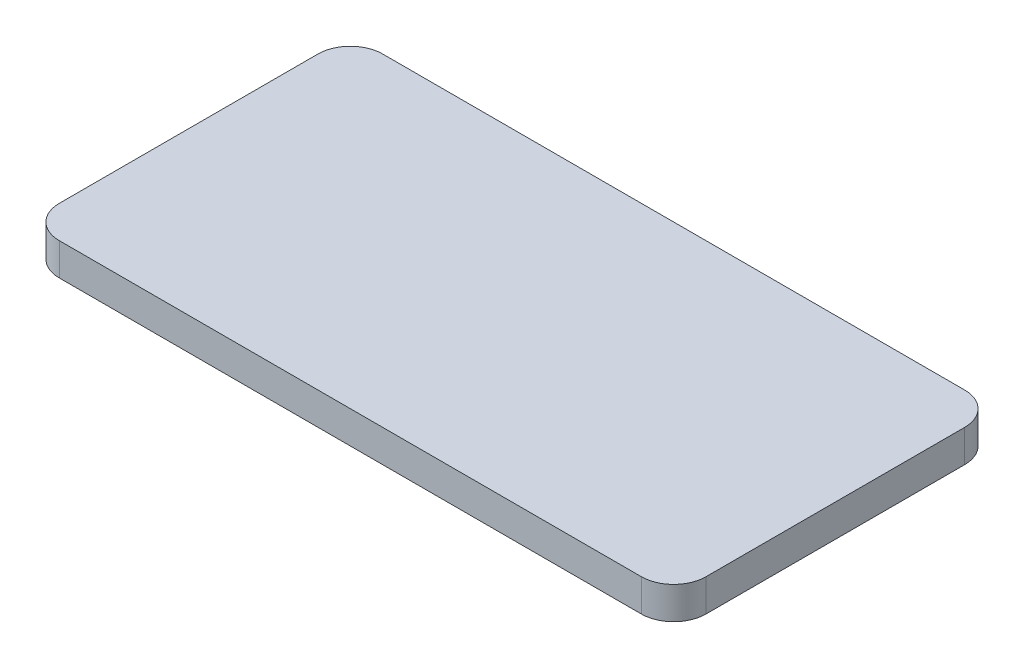
ISO-10303-21;
HEADER;
FILE_DESCRIPTION(('STEP AP214'),'2;1');
FILE_NAME('part.step','',(''),(''),'','','');
FILE_SCHEMA(('AUTOMOTIVE_DESIGN { 1 0 10303 214 1 1 1 1 }'));
ENDSEC;
DATA;
#1=APPLICATION_CONTEXT('core data for automotive mechanical design processes');
#2=APPLICATION_PROTOCOL_DEFINITION('international standard','automotive_design',2000,#1);
#3=PRODUCT_CONTEXT('',#1,'mechanical');
#4=PRODUCT('Part','Part','',(#3));
#5=PRODUCT_RELATED_PRODUCT_CATEGORY('part','',(#4));
#6=PRODUCT_DEFINITION_FORMATION('','',#4);
#7=PRODUCT_DEFINITION_CONTEXT('part definition',#1,'design');
#8=PRODUCT_DEFINITION('design','',#6,#7);
#9=PRODUCT_DEFINITION_SHAPE('','',#8);
#10=(LENGTH_UNIT() NAMED_UNIT(*) SI_UNIT(.MILLI.,.METRE.));
#11=(NAMED_UNIT(*) PLANE_ANGLE_UNIT() SI_UNIT($,.RADIAN.));
#12=(NAMED_UNIT(*) SI_UNIT($,.STERADIAN.) SOLID_ANGLE_UNIT());
#13=UNCERTAINTY_MEASURE_WITH_UNIT(LENGTH_MEASURE(1.E-05),#10,'distance_accuracy_value','');
#14=(GEOMETRIC_REPRESENTATION_CONTEXT(3) GLOBAL_UNCERTAINTY_ASSIGNED_CONTEXT((#13)) GLOBAL_UNIT_ASSIGNED_CONTEXT((#10,
#11,#12)) REPRESENTATION_CONTEXT('',''));
#15=CARTESIAN_POINT('',(0.,0.,0.));
#16=DIRECTION('',(0.,0.,1.));
#17=DIRECTION('',(1.,0.,0.));
#18=AXIS2_PLACEMENT_3D('',#15,#16,#17);
#19=CARTESIAN_POINT('',(44.7077153816655,1.,19.));
#20=DIRECTION('',(1.,0.,0.));
#21=DIRECTION('',(0.,0.,-1.));
#22=AXIS2_PLACEMENT_3D('',#19,#20,#21);
#23=PLANE('',#22);
#24=DIRECTION('',(0.,1.,0.));
#25=VECTOR('',#24,1.);
#26=CARTESIAN_POINT('',(44.7077153816655,-1.,15.1511621443385));
#27=LINE('',#26,#25);
#28=CARTESIAN_POINT('',(44.7077153816655,1.,15.1511621443385));
#29=VERTEX_POINT('',#28);
#30=CARTESIAN_POINT('',(44.7077153816655,0.,15.1511621443385));
#31=VERTEX_POINT('',#30);
#32=EDGE_CURVE('E290',#29,#31,#27,.F.);
#33=ORIENTED_EDGE('',*,*,#32,.F.);
#34=DIRECTION('',(0.,0.,1.));
#35=VECTOR('',#34,1.);
#36=CARTESIAN_POINT('',(44.7077153816655,1.,19.));
#37=LINE('',#36,#35);
#38=CARTESIAN_POINT('',(44.7077153816655,1.,6.00000000000001));
#39=VERTEX_POINT('',#38);
#40=EDGE_CURVE('E300',#39,#29,#37,.T.);
#41=ORIENTED_EDGE('',*,*,#40,.F.);
#42=DIRECTION('',(0.,-1.,0.));
#43=VECTOR('',#42,1.);
#44=CARTESIAN_POINT('',(44.7077153816655,1.,6.00000000000001));
#45=LINE('',#44,#43);
#46=CARTESIAN_POINT('',(44.7077153816655,0.,6.00000000000001));
#47=VERTEX_POINT('',#46);
#48=EDGE_CURVE('E575',#39,#47,#45,.T.);
#49=ORIENTED_EDGE('',*,*,#48,.T.);
#50=DIRECTION('',(0.,0.,1.));
#51=VECTOR('',#50,1.);
#52=CARTESIAN_POINT('',(44.7077153816655,0.,19.));
#53=LINE('',#52,#51);
#54=EDGE_CURVE('E41',#47,#31,#53,.T.);
#55=ORIENTED_EDGE('',*,*,#54,.T.);
#56=EDGE_LOOP('',(#33,#41,#49,#55));
#57=FACE_BOUND('',#56,.T.);
#58=ADVANCED_FACE('F37',(#57),#23,.F.);
#59=DIRECTION('',(0.,1.,0.));
#60=VECTOR('',#59,1.);
#61=CARTESIAN_POINT('',(44.7077153816655,-1.,15.3712700855343));
#62=LINE('',#61,#60);
#63=CARTESIAN_POINT('',(44.7077153816655,0.,15.3712700855343));
#64=VERTEX_POINT('',#63);
#65=CARTESIAN_POINT('',(44.7077153816655,1.,15.3712700855343));
#66=VERTEX_POINT('',#65);
#67=EDGE_CURVE('E63',#64,#66,#62,.T.);
#68=ORIENTED_EDGE('',*,*,#67,.F.);
#69=CARTESIAN_POINT('',(44.7077153816655,0.,19.));
#70=VERTEX_POINT('',#69);
#71=EDGE_CURVE('E332',#64,#70,#53,.T.);
#72=ORIENTED_EDGE('',*,*,#71,.T.);
#73=DIRECTION('',(0.,-1.,0.));
#74=VECTOR('',#73,1.);
#75=CARTESIAN_POINT('',(44.7077153816655,1.,19.));
#76=LINE('',#75,#74);
#77=CARTESIAN_POINT('',(44.7077153816655,1.,19.));
#78=VERTEX_POINT('',#77);
#79=EDGE_CURVE('E570',#78,#70,#76,.T.);
#80=ORIENTED_EDGE('',*,*,#79,.F.);
#81=EDGE_CURVE('E304',#66,#78,#37,.T.);
#82=ORIENTED_EDGE('',*,*,#81,.F.);
#83=EDGE_LOOP('',(#68,#72,#80,#82));
#84=FACE_BOUND('',#83,.T.);
#85=ADVANCED_FACE('F385',(#84),#23,.F.);
#86=CARTESIAN_POINT('',(45.,5.,-20.));
#87=DIRECTION('',(0.,-1.,0.));
#88=DIRECTION('',(0.,0.,-1.));
#89=AXIS2_PLACEMENT_3D('',#86,#87,#88);
#90=CYLINDRICAL_SURFACE('',#89,5.);
#91=CARTESIAN_POINT('',(45.,0.,-20.));
#92=DIRECTION('',(0.,1.,0.));
#93=DIRECTION('',(0.,0.,-1.));
#94=AXIS2_PLACEMENT_3D('',#91,#92,#93);
#95=CIRCLE('',#94,5.);
#96=CARTESIAN_POINT('',(50.,0.,-20.));
#97=VERTEX_POINT('',#96);
#98=CARTESIAN_POINT('',(45.,0.,-25.));
#99=VERTEX_POINT('',#98);
#100=EDGE_CURVE('E467',#97,#99,#95,.T.);
#101=ORIENTED_EDGE('',*,*,#100,.T.);
#102=DIRECTION('',(0.,-1.,0.));
#103=VECTOR('',#102,1.);
#104=CARTESIAN_POINT('',(45.,5.,-25.));
#105=LINE('',#104,#103);
#106=CARTESIAN_POINT('',(45.,5.,-25.));
#107=VERTEX_POINT('',#106);
#108=EDGE_CURVE('E503',#107,#99,#105,.T.);
#109=ORIENTED_EDGE('',*,*,#108,.F.);
#110=CARTESIAN_POINT('',(45.,5.,-20.));
#111=DIRECTION('',(0.,1.,0.));
#112=DIRECTION('',(0.,0.,-1.));
#113=AXIS2_PLACEMENT_3D('',#110,#111,#112);
#114=CIRCLE('',#113,5.);
#115=CARTESIAN_POINT('',(50.,5.,-20.));
#116=VERTEX_POINT('',#115);
#117=EDGE_CURVE('E448',#116,#107,#114,.T.);
#118=ORIENTED_EDGE('',*,*,#117,.F.);
#119=DIRECTION('',(0.,-1.,0.));
#120=VECTOR('',#119,1.);
#121=CARTESIAN_POINT('',(50.,5.,-20.));
#122=LINE('',#121,#120);
#123=EDGE_CURVE('E466',#116,#97,#122,.T.);
#124=ORIENTED_EDGE('',*,*,#123,.T.);
#125=EDGE_LOOP('',(#101,#109,#118,#124));
#126=FACE_BOUND('',#125,.T.);
#127=ADVANCED_FACE('F39',(#126),#90,.T.);
#128=CARTESIAN_POINT('',(-45.,5.,-25.));
#129=DIRECTION('',(0.,0.,1.));
#130=DIRECTION('',(1.,0.,0.));
#131=AXIS2_PLACEMENT_3D('',#128,#129,#130);
#132=PLANE('',#131);
#133=DIRECTION('',(-1.,0.,0.));
#134=VECTOR('',#133,1.);
#135=CARTESIAN_POINT('',(-45.,0.,-25.));
#136=LINE('',#135,#134);
#137=CARTESIAN_POINT('',(-45.,0.,-25.));
#138=VERTEX_POINT('',#137);
#139=EDGE_CURVE('E470',#99,#138,#136,.T.);
#140=ORIENTED_EDGE('',*,*,#139,.T.);
#141=DIRECTION('',(0.,-1.,0.));
#142=VECTOR('',#141,1.);
#143=CARTESIAN_POINT('',(-45.,5.,-25.));
#144=LINE('',#143,#142);
#145=CARTESIAN_POINT('',(-45.,5.,-25.));
#146=VERTEX_POINT('',#145);
#147=EDGE_CURVE('E500',#146,#138,#144,.T.);
#148=ORIENTED_EDGE('',*,*,#147,.F.);
#149=DIRECTION('',(-1.,0.,0.));
#150=VECTOR('',#149,1.);
#151=CARTESIAN_POINT('',(-45.,5.,-25.));
#152=LINE('',#151,#150);
#153=EDGE_CURVE('E451',#107,#146,#152,.T.);
#154=ORIENTED_EDGE('',*,*,#153,.F.);
#155=ORIENTED_EDGE('',*,*,#108,.T.);
#156=EDGE_LOOP('',(#140,#148,#154,#155));
#157=FACE_BOUND('',#156,.T.);
#158=ADVANCED_FACE('F378',(#157),#132,.F.);
#159=CARTESIAN_POINT('',(-45.,5.,-20.));
#160=DIRECTION('',(0.,-1.,0.));
#161=DIRECTION('',(0.,0.,-1.));
#162=AXIS2_PLACEMENT_3D('',#159,#160,#161);
#163=CYLINDRICAL_SURFACE('',#162,5.);
#164=CARTESIAN_POINT('',(-45.,0.,-20.));
#165=DIRECTION('',(0.,1.,0.));
#166=DIRECTION('',(0.,0.,-1.));
#167=AXIS2_PLACEMENT_3D('',#164,#165,#166);
#168=CIRCLE('',#167,5.);
#169=CARTESIAN_POINT('',(-50.,0.,-20.));
#170=VERTEX_POINT('',#169);
#171=EDGE_CURVE('E472',#138,#170,#168,.T.);
#172=ORIENTED_EDGE('',*,*,#171,.T.);
#173=DIRECTION('',(0.,-1.,0.));
#174=VECTOR('',#173,1.);
#175=CARTESIAN_POINT('',(-50.,5.,-20.));
#176=LINE('',#175,#174);
#177=CARTESIAN_POINT('',(-50.,5.,-20.));
#178=VERTEX_POINT('',#177);
#179=EDGE_CURVE('E497',#178,#170,#176,.T.);
#180=ORIENTED_EDGE('',*,*,#179,.F.);
#181=CARTESIAN_POINT('',(-45.,5.,-20.));
#182=DIRECTION('',(0.,1.,0.));
#183=DIRECTION('',(0.,0.,-1.));
#184=AXIS2_PLACEMENT_3D('',#181,#182,#183);
#185=CIRCLE('',#184,5.);
#186=EDGE_CURVE('E454',#146,#178,#185,.T.);
#187=ORIENTED_EDGE('',*,*,#186,.F.);
#188=ORIENTED_EDGE('',*,*,#147,.T.);
#189=EDGE_LOOP('',(#172,#180,#187,#188));
#190=FACE_BOUND('',#189,.T.);
#191=ADVANCED_FACE('F375',(#190),#163,.T.);
#192=CARTESIAN_POINT('',(-50.,5.,20.));
#193=DIRECTION('',(1.,0.,0.));
#194=DIRECTION('',(0.,0.,-1.));
#195=AXIS2_PLACEMENT_3D('',#192,#193,#194);
#196=PLANE('',#195);
#197=DIRECTION('',(0.,0.,1.));
#198=VECTOR('',#197,1.);
#199=CARTESIAN_POINT('',(-50.,1.77048638613622,1.99999999999996));
#200=LINE('',#199,#198);
#201=CARTESIAN_POINT('',(-50.,1.77048638613622,-2.00000000000003));
#202=VERTEX_POINT('',#201);
#203=CARTESIAN_POINT('',(-50.,1.77048638613622,1.99999999999996));
#204=VERTEX_POINT('',#203);
#205=EDGE_CURVE('E255',#202,#204,#200,.T.);
#206=ORIENTED_EDGE('',*,*,#205,.F.);
#207=CARTESIAN_POINT('',(-50.,2.27048638613622,-2.00000000000003));
#208=DIRECTION('',(-1.,0.,0.));
#209=DIRECTION('',(0.,0.,-1.));
#210=AXIS2_PLACEMENT_3D('',#207,#208,#209);
#211=CIRCLE('',#210,0.5);
#212=CARTESIAN_POINT('',(-50.,2.27048638613622,-2.50000000000003));
#213=VERTEX_POINT('',#212);
#214=EDGE_CURVE('E55',#213,#202,#211,.T.);
#215=ORIENTED_EDGE('',*,*,#214,.F.);
#216=DIRECTION('',(0.,-1.,0.));
#217=VECTOR('',#216,1.);
#218=CARTESIAN_POINT('',(-50.,2.27048638613622,-2.50000000000003));
#219=LINE('',#218,#217);
#220=CARTESIAN_POINT('',(-50.,3.27048638613622,-2.50000000000004));
#221=VERTEX_POINT('',#220);
#222=EDGE_CURVE('E235',#221,#213,#219,.T.);
#223=ORIENTED_EDGE('',*,*,#222,.F.);
#224=CARTESIAN_POINT('',(-50.,3.27048638613622,-2.00000000000003));
#225=DIRECTION('',(-1.,0.,0.));
#226=DIRECTION('',(0.,0.,-1.));
#227=AXIS2_PLACEMENT_3D('',#224,#225,#226);
#228=CIRCLE('',#227,0.5);
#229=CARTESIAN_POINT('',(-50.,3.77048638613622,-2.00000000000003));
#230=VERTEX_POINT('',#229);
#231=EDGE_CURVE('E238',#230,#221,#228,.T.);
#232=ORIENTED_EDGE('',*,*,#231,.F.);
#233=DIRECTION('',(0.,0.,-1.));
#234=VECTOR('',#233,1.);
#235=CARTESIAN_POINT('',(-50.,3.77048638613622,1.99999999999997));
#236=LINE('',#235,#234);
#237=CARTESIAN_POINT('',(-50.,3.77048638613622,1.99999999999997));
#238=VERTEX_POINT('',#237);
#239=EDGE_CURVE('E266',#238,#230,#236,.T.);
#240=ORIENTED_EDGE('',*,*,#239,.F.);
#241=CARTESIAN_POINT('',(-50.,3.27048638613622,1.99999999999997));
#242=DIRECTION('',(-1.,0.,0.));
#243=DIRECTION('',(0.,0.,1.));
#244=AXIS2_PLACEMENT_3D('',#241,#242,#243);
#245=CIRCLE('',#244,0.5);
#246=CARTESIAN_POINT('',(-50.,3.27048638613622,2.49999999999996));
#247=VERTEX_POINT('',#246);
#248=EDGE_CURVE('E263',#247,#238,#245,.T.);
#249=ORIENTED_EDGE('',*,*,#248,.F.);
#250=DIRECTION('',(0.,1.,0.));
#251=VECTOR('',#250,1.);
#252=CARTESIAN_POINT('',(-50.,2.27048638613622,2.49999999999996));
#253=LINE('',#252,#251);
#254=CARTESIAN_POINT('',(-50.,2.27048638613622,2.49999999999996));
#255=VERTEX_POINT('',#254);
#256=EDGE_CURVE('E260',#255,#247,#253,.T.);
#257=ORIENTED_EDGE('',*,*,#256,.F.);
#258=CARTESIAN_POINT('',(-50.,2.27048638613622,1.99999999999996));
#259=DIRECTION('',(-1.,0.,0.));
#260=DIRECTION('',(0.,0.,1.));
#261=AXIS2_PLACEMENT_3D('',#258,#259,#260);
#262=CIRCLE('',#261,0.5);
#263=EDGE_CURVE('E257',#204,#255,#262,.T.);
#264=ORIENTED_EDGE('',*,*,#263,.F.);
#265=EDGE_LOOP('',(#206,#215,#223,#232,#240,#249,#257,#264));
#266=FACE_BOUND('',#265,.T.);
#267=DIRECTION('',(0.,0.,1.));
#268=VECTOR('',#267,1.);
#269=CARTESIAN_POINT('',(-50.,0.,20.));
#270=LINE('',#269,#268);
#271=CARTESIAN_POINT('',(-50.,0.,20.));
#272=VERTEX_POINT('',#271);
#273=EDGE_CURVE('E474',#170,#272,#270,.T.);
#274=ORIENTED_EDGE('',*,*,#273,.T.);
#275=DIRECTION('',(0.,-1.,0.));
#276=VECTOR('',#275,1.);
#277=CARTESIAN_POINT('',(-50.,5.,20.));
#278=LINE('',#277,#276);
#279=CARTESIAN_POINT('',(-50.,5.,20.));
#280=VERTEX_POINT('',#279);
#281=EDGE_CURVE('E494',#280,#272,#278,.T.);
#282=ORIENTED_EDGE('',*,*,#281,.F.);
#283=DIRECTION('',(0.,0.,1.));
#284=VECTOR('',#283,1.);
#285=CARTESIAN_POINT('',(-50.,5.,20.));
#286=LINE('',#285,#284);
#287=EDGE_CURVE('E456',#178,#280,#286,.T.);
#288=ORIENTED_EDGE('',*,*,#287,.F.);
#289=ORIENTED_EDGE('',*,*,#179,.T.);
#290=EDGE_LOOP('',(#274,#282,#288,#289));
#291=FACE_BOUND('',#290,.T.);
#292=ADVANCED_FACE('F371',(#266,#291),#196,.F.);
#293=CARTESIAN_POINT('',(-45.,5.,20.));
#294=DIRECTION('',(0.,-1.,0.));
#295=DIRECTION('',(0.,0.,-1.));
#296=AXIS2_PLACEMENT_3D('',#293,#294,#295);
#297=CYLINDRICAL_SURFACE('',#296,5.);
#298=CARTESIAN_POINT('',(-45.,0.,20.));
#299=DIRECTION('',(0.,1.,0.));
#300=DIRECTION('',(0.,0.,-1.));
#301=AXIS2_PLACEMENT_3D('',#298,#299,#300);
#302=CIRCLE('',#301,5.);
#303=CARTESIAN_POINT('',(-45.,0.,25.));
#304=VERTEX_POINT('',#303);
#305=EDGE_CURVE('E476',#272,#304,#302,.T.);
#306=ORIENTED_EDGE('',*,*,#305,.T.);
#307=DIRECTION('',(0.,-1.,0.));
#308=VECTOR('',#307,1.);
#309=CARTESIAN_POINT('',(-45.,5.,25.));
#310=LINE('',#309,#308);
#311=CARTESIAN_POINT('',(-45.,5.,25.));
#312=VERTEX_POINT('',#311);
#313=EDGE_CURVE('E491',#312,#304,#310,.T.);
#314=ORIENTED_EDGE('',*,*,#313,.F.);
#315=CARTESIAN_POINT('',(-45.,5.,20.));
#316=DIRECTION('',(0.,1.,0.));
#317=DIRECTION('',(0.,0.,-1.));
#318=AXIS2_PLACEMENT_3D('',#315,#316,#317);
#319=CIRCLE('',#318,5.);
#320=EDGE_CURVE('E458',#280,#312,#319,.T.);
#321=ORIENTED_EDGE('',*,*,#320,.F.);
#322=ORIENTED_EDGE('',*,*,#281,.T.);
#323=EDGE_LOOP('',(#306,#314,#321,#322));
#324=FACE_BOUND('',#323,.T.);
#325=ADVANCED_FACE('F367',(#324),#297,.T.);
#326=CARTESIAN_POINT('',(-45.,5.,25.));
#327=DIRECTION('',(0.,0.,-1.));
#328=DIRECTION('',(-1.,0.,0.));
#329=AXIS2_PLACEMENT_3D('',#326,#327,#328);
#330=PLANE('',#329);
#331=DIRECTION('',(1.,0.,0.));
#332=VECTOR('',#331,1.);
#333=CARTESIAN_POINT('',(-45.,0.,25.));
#334=LINE('',#333,#332);
#335=CARTESIAN_POINT('',(45.,0.,25.));
#336=VERTEX_POINT('',#335);
#337=EDGE_CURVE('E478',#304,#336,#334,.T.);
#338=ORIENTED_EDGE('',*,*,#337,.T.);
#339=DIRECTION('',(0.,-1.,0.));
#340=VECTOR('',#339,1.);
#341=CARTESIAN_POINT('',(45.,5.,25.));
#342=LINE('',#341,#340);
#343=CARTESIAN_POINT('',(45.,5.,25.));
#344=VERTEX_POINT('',#343);
#345=EDGE_CURVE('E488',#344,#336,#342,.T.);
#346=ORIENTED_EDGE('',*,*,#345,.F.);
#347=DIRECTION('',(1.,0.,0.));
#348=VECTOR('',#347,1.);
#349=CARTESIAN_POINT('',(-45.,5.,25.));
#350=LINE('',#349,#348);
#351=EDGE_CURVE('E460',#312,#344,#350,.T.);
#352=ORIENTED_EDGE('',*,*,#351,.F.);
#353=ORIENTED_EDGE('',*,*,#313,.T.);
#354=EDGE_LOOP('',(#338,#346,#352,#353));
#355=FACE_BOUND('',#354,.T.);
#356=ADVANCED_FACE('F363',(#355),#330,.F.);
#357=CARTESIAN_POINT('',(45.,5.,20.));
#358=DIRECTION('',(0.,-1.,0.));
#359=DIRECTION('',(0.,0.,-1.));
#360=AXIS2_PLACEMENT_3D('',#357,#358,#359);
#361=CYLINDRICAL_SURFACE('',#360,5.);
#362=CARTESIAN_POINT('',(45.,0.,20.));
#363=DIRECTION('',(0.,1.,0.));
#364=DIRECTION('',(0.,0.,-1.));
#365=AXIS2_PLACEMENT_3D('',#362,#363,#364);
#366=CIRCLE('',#365,5.);
#367=CARTESIAN_POINT('',(50.,0.,20.));
#368=VERTEX_POINT('',#367);
#369=EDGE_CURVE('E480',#336,#368,#366,.T.);
#370=ORIENTED_EDGE('',*,*,#369,.T.);
#371=DIRECTION('',(0.,-1.,0.));
#372=VECTOR('',#371,1.);
#373=CARTESIAN_POINT('',(50.,5.,20.));
#374=LINE('',#373,#372);
#375=CARTESIAN_POINT('',(50.,5.,20.));
#376=VERTEX_POINT('',#375);
#377=EDGE_CURVE('E485',#376,#368,#374,.T.);
#378=ORIENTED_EDGE('',*,*,#377,.F.);
#379=CARTESIAN_POINT('',(45.,5.,20.));
#380=DIRECTION('',(0.,1.,0.));
#381=DIRECTION('',(0.,0.,-1.));
#382=AXIS2_PLACEMENT_3D('',#379,#380,#381);
#383=CIRCLE('',#382,5.);
#384=EDGE_CURVE('E462',#344,#376,#383,.T.);
#385=ORIENTED_EDGE('',*,*,#384,.F.);
#386=ORIENTED_EDGE('',*,*,#345,.T.);
#387=EDGE_LOOP('',(#370,#378,#385,#386));
#388=FACE_BOUND('',#387,.T.);
#389=ADVANCED_FACE('F359',(#388),#361,.T.);
#390=CARTESIAN_POINT('',(50.,5.,20.));
#391=DIRECTION('',(-1.,0.,0.));
#392=DIRECTION('',(0.,0.,1.));
#393=AXIS2_PLACEMENT_3D('',#390,#391,#392);
#394=PLANE('',#393);
#395=DIRECTION('',(0.,0.,-1.));
#396=VECTOR('',#395,1.);
#397=CARTESIAN_POINT('',(50.,0.,20.));
#398=LINE('',#397,#396);
#399=EDGE_CURVE('E452',#368,#97,#398,.T.);
#400=ORIENTED_EDGE('',*,*,#399,.T.);
#401=ORIENTED_EDGE('',*,*,#123,.F.);
#402=DIRECTION('',(0.,0.,-1.));
#403=VECTOR('',#402,1.);
#404=CARTESIAN_POINT('',(50.,5.,20.));
#405=LINE('',#404,#403);
#406=EDGE_CURVE('E464',#376,#116,#405,.T.);
#407=ORIENTED_EDGE('',*,*,#406,.F.);
#408=ORIENTED_EDGE('',*,*,#377,.T.);
#409=EDGE_LOOP('',(#400,#401,#407,#408));
#410=FACE_BOUND('',#409,.T.);
#411=ADVANCED_FACE('F356',(#410),#394,.F.);
#412=CARTESIAN_POINT('',(45.,5.,-20.));
#413=DIRECTION('',(0.,-1.,0.));
#414=DIRECTION('',(0.,0.,-1.));
#415=AXIS2_PLACEMENT_3D('',#412,#413,#414);
#416=PLANE('',#415);
#417=ORIENTED_EDGE('',*,*,#117,.T.);
#418=ORIENTED_EDGE('',*,*,#153,.T.);
#419=ORIENTED_EDGE('',*,*,#186,.T.);
#420=ORIENTED_EDGE('',*,*,#287,.T.);
#421=ORIENTED_EDGE('',*,*,#320,.T.);
#422=ORIENTED_EDGE('',*,*,#351,.T.);
#423=ORIENTED_EDGE('',*,*,#384,.T.);
#424=ORIENTED_EDGE('',*,*,#406,.T.);
#425=EDGE_LOOP('',(#417,#418,#419,#420,#421,#422,#423,#424));
#426=FACE_BOUND('',#425,.T.);
#427=ADVANCED_FACE('F353',(#426),#416,.F.);
#428=CARTESIAN_POINT('',(45.,0.,-20.));
#429=DIRECTION('',(0.,-1.,0.));
#430=DIRECTION('',(0.,0.,-1.));
#431=AXIS2_PLACEMENT_3D('',#428,#429,#430);
#432=PLANE('',#431);
#433=ORIENTED_EDGE('',*,*,#71,.F.);
#434=CARTESIAN_POINT('',(44.7077153816655,0.,15.3712700855343));
#435=CARTESIAN_POINT('',(44.7111776298207,0.,15.2612161149364));
#436=CARTESIAN_POINT('',(44.7077153816655,0.,15.1511621443385));
#437=B_SPLINE_CURVE_WITH_KNOTS('',2,(#434,#435,#436),.UNSPECIFIED.,.F.,.F.,(3,3),(0.,1.),.UNSPECIFIED.);
#438=EDGE_CURVE('E289',#64,#31,#437,.T.);
#439=ORIENTED_EDGE('',*,*,#438,.T.);
#440=ORIENTED_EDGE('',*,*,#54,.F.);
#441=CARTESIAN_POINT('',(43.7077153816655,0.,6.));
#442=DIRECTION('',(0.,-1.,0.));
#443=DIRECTION('',(0.,0.,1.));
#444=AXIS2_PLACEMENT_3D('',#441,#442,#443);
#445=CIRCLE('',#444,1.);
#446=CARTESIAN_POINT('',(43.7077153816655,0.,5.));
#447=VERTEX_POINT('',#446);
#448=EDGE_CURVE('E330',#447,#47,#445,.T.);
#449=ORIENTED_EDGE('',*,*,#448,.F.);
#450=DIRECTION('',(1.,0.,0.));
#451=VECTOR('',#450,1.);
#452=CARTESIAN_POINT('',(43.7077153816655,0.,5.));
#453=LINE('',#452,#451);
#454=CARTESIAN_POINT('',(30.7077153816655,0.,5.));
#455=VERTEX_POINT('',#454);
#456=EDGE_CURVE('E327',#455,#447,#453,.T.);
#457=ORIENTED_EDGE('',*,*,#456,.F.);
#458=CARTESIAN_POINT('',(30.7077153816655,0.,6.));
#459=DIRECTION('',(0.,-1.,0.));
#460=DIRECTION('',(0.,0.,-1.));
#461=AXIS2_PLACEMENT_3D('',#458,#459,#460);
#462=CIRCLE('',#461,1.);
#463=CARTESIAN_POINT('',(29.7077153816655,0.,6.00000000000001));
#464=VERTEX_POINT('',#463);
#465=EDGE_CURVE('E324',#464,#455,#462,.T.);
#466=ORIENTED_EDGE('',*,*,#465,.F.);
#467=DIRECTION('',(0.,0.,-1.));
#468=VECTOR('',#467,1.);
#469=CARTESIAN_POINT('',(29.7077153816655,0.,19.));
#470=LINE('',#469,#468);
#471=CARTESIAN_POINT('',(29.7077153816655,0.,19.));
#472=VERTEX_POINT('',#471);
#473=EDGE_CURVE('E320',#472,#464,#470,.T.);
#474=ORIENTED_EDGE('',*,*,#473,.F.);
#475=CARTESIAN_POINT('',(30.7077153816655,0.,19.));
#476=DIRECTION('',(0.,-1.,0.));
#477=DIRECTION('',(0.,0.,1.));
#478=AXIS2_PLACEMENT_3D('',#475,#476,#477);
#479=CIRCLE('',#478,1.);
#480=CARTESIAN_POINT('',(30.7077153816655,0.,20.));
#481=VERTEX_POINT('',#480);
#482=EDGE_CURVE('E318',#481,#472,#479,.T.);
#483=ORIENTED_EDGE('',*,*,#482,.F.);
#484=DIRECTION('',(-1.,0.,0.));
#485=VECTOR('',#484,1.);
#486=CARTESIAN_POINT('',(43.7077153816655,0.,20.));
#487=LINE('',#486,#485);
#488=CARTESIAN_POINT('',(43.7077153816655,0.,20.));
#489=VERTEX_POINT('',#488);
#490=EDGE_CURVE('E560',#489,#481,#487,.T.);
#491=ORIENTED_EDGE('',*,*,#490,.F.);
#492=CARTESIAN_POINT('',(43.7077153816655,0.,19.));
#493=DIRECTION('',(0.,-1.,0.));
#494=DIRECTION('',(0.,0.,-1.));
#495=AXIS2_PLACEMENT_3D('',#492,#493,#494);
#496=CIRCLE('',#495,1.);
#497=EDGE_CURVE('E335',#70,#489,#496,.T.);
#498=ORIENTED_EDGE('',*,*,#497,.F.);
#499=EDGE_LOOP('',(#433,#439,#440,#449,#457,#466,#474,#483,#491,#498));
#500=FACE_BOUND('',#499,.T.);
#501=ORIENTED_EDGE('',*,*,#100,.F.);
#502=ORIENTED_EDGE('',*,*,#399,.F.);
#503=ORIENTED_EDGE('',*,*,#369,.F.);
#504=ORIENTED_EDGE('',*,*,#337,.F.);
#505=ORIENTED_EDGE('',*,*,#305,.F.);
#506=ORIENTED_EDGE('',*,*,#273,.F.);
#507=ORIENTED_EDGE('',*,*,#171,.F.);
#508=ORIENTED_EDGE('',*,*,#139,.F.);
#509=EDGE_LOOP('',(#501,#502,#503,#504,#505,#506,#507,#508));
#510=FACE_BOUND('',#509,.T.);
#511=ADVANCED_FACE('F342',(#500,#510),#432,.T.);
#512=CARTESIAN_POINT('',(30.7077153816655,1.,19.));
#513=DIRECTION('',(0.,-1.,0.));
#514=DIRECTION('',(0.,0.,-1.));
#515=AXIS2_PLACEMENT_3D('',#512,#513,#514);
#516=CYLINDRICAL_SURFACE('',#515,1.);
#517=ORIENTED_EDGE('',*,*,#482,.T.);
#518=DIRECTION('',(0.,-1.,0.));
#519=VECTOR('',#518,1.);
#520=CARTESIAN_POINT('',(29.7077153816655,1.,19.));
#521=LINE('',#520,#519);
#522=CARTESIAN_POINT('',(29.7077153816655,1.,19.));
#523=VERTEX_POINT('',#522);
#524=EDGE_CURVE('E317',#523,#472,#521,.T.);
#525=ORIENTED_EDGE('',*,*,#524,.F.);
#526=CARTESIAN_POINT('',(30.7077153816655,1.,19.));
#527=DIRECTION('',(0.,-1.,0.));
#528=DIRECTION('',(0.,0.,1.));
#529=AXIS2_PLACEMENT_3D('',#526,#527,#528);
#530=CIRCLE('',#529,1.);
#531=CARTESIAN_POINT('',(30.7077153816655,1.,20.));
#532=VERTEX_POINT('',#531);
#533=EDGE_CURVE('E558',#532,#523,#530,.T.);
#534=ORIENTED_EDGE('',*,*,#533,.F.);
#535=DIRECTION('',(0.,-1.,0.));
#536=VECTOR('',#535,1.);
#537=CARTESIAN_POINT('',(30.7077153816655,1.,20.));
#538=LINE('',#537,#536);
#539=EDGE_CURVE('E425',#532,#481,#538,.T.);
#540=ORIENTED_EDGE('',*,*,#539,.T.);
#541=EDGE_LOOP('',(#517,#525,#534,#540));
#542=FACE_BOUND('',#541,.T.);
#543=ADVANCED_FACE('F352',(#542),#516,.F.);
#544=CARTESIAN_POINT('',(43.7077153816655,1.,20.));
#545=DIRECTION('',(0.,0.,1.));
#546=DIRECTION('',(1.,0.,0.));
#547=AXIS2_PLACEMENT_3D('',#544,#545,#546);
#548=PLANE('',#547);
#549=ORIENTED_EDGE('',*,*,#490,.T.);
#550=ORIENTED_EDGE('',*,*,#539,.F.);
#551=DIRECTION('',(-1.,0.,0.));
#552=VECTOR('',#551,1.);
#553=CARTESIAN_POINT('',(43.7077153816655,1.,20.));
#554=LINE('',#553,#552);
#555=CARTESIAN_POINT('',(43.7077153816655,1.,20.));
#556=VERTEX_POINT('',#555);
#557=EDGE_CURVE('E314',#556,#532,#554,.T.);
#558=ORIENTED_EDGE('',*,*,#557,.F.);
#559=DIRECTION('',(0.,-1.,0.));
#560=VECTOR('',#559,1.);
#561=CARTESIAN_POINT('',(43.7077153816655,1.,20.));
#562=LINE('',#561,#560);
#563=EDGE_CURVE('E574',#556,#489,#562,.T.);
#564=ORIENTED_EDGE('',*,*,#563,.T.);
#565=EDGE_LOOP('',(#549,#550,#558,#564));
#566=FACE_BOUND('',#565,.T.);
#567=ADVANCED_FACE('F415',(#566),#548,.F.);
#568=CARTESIAN_POINT('',(43.7077153816655,1.,19.));
#569=DIRECTION('',(0.,-1.,0.));
#570=DIRECTION('',(0.,0.,-1.));
#571=AXIS2_PLACEMENT_3D('',#568,#569,#570);
#572=CYLINDRICAL_SURFACE('',#571,1.);
#573=ORIENTED_EDGE('',*,*,#497,.T.);
#574=ORIENTED_EDGE('',*,*,#563,.F.);
#575=CARTESIAN_POINT('',(43.7077153816655,1.,19.));
#576=DIRECTION('',(0.,-1.,0.));
#577=DIRECTION('',(0.,0.,-1.));
#578=AXIS2_PLACEMENT_3D('',#575,#576,#577);
#579=CIRCLE('',#578,1.);
#580=EDGE_CURVE('E303',#78,#556,#579,.T.);
#581=ORIENTED_EDGE('',*,*,#580,.F.);
#582=ORIENTED_EDGE('',*,*,#79,.T.);
#583=EDGE_LOOP('',(#573,#574,#581,#582));
#584=FACE_BOUND('',#583,.T.);
#585=ADVANCED_FACE('F396',(#584),#572,.F.);
#586=CARTESIAN_POINT('',(43.7077153816655,1.,6.));
#587=DIRECTION('',(0.,-1.,0.));
#588=DIRECTION('',(0.,0.,-1.));
#589=AXIS2_PLACEMENT_3D('',#586,#587,#588);
#590=CYLINDRICAL_SURFACE('',#589,1.);
#591=ORIENTED_EDGE('',*,*,#448,.T.);
#592=ORIENTED_EDGE('',*,*,#48,.F.);
#593=CARTESIAN_POINT('',(43.7077153816655,1.,6.));
#594=DIRECTION('',(0.,-1.,0.));
#595=DIRECTION('',(0.,0.,1.));
#596=AXIS2_PLACEMENT_3D('',#593,#594,#595);
#597=CIRCLE('',#596,1.);
#598=CARTESIAN_POINT('',(43.7077153816655,1.,5.));
#599=VERTEX_POINT('',#598);
#600=EDGE_CURVE('E309',#599,#39,#597,.T.);
#601=ORIENTED_EDGE('',*,*,#600,.F.);
#602=DIRECTION('',(0.,-1.,0.));
#603=VECTOR('',#602,1.);
#604=CARTESIAN_POINT('',(43.7077153816655,1.,5.));
#605=LINE('',#604,#603);
#606=EDGE_CURVE('E444',#599,#447,#605,.T.);
#607=ORIENTED_EDGE('',*,*,#606,.T.);
#608=EDGE_LOOP('',(#591,#592,#601,#607));
#609=FACE_BOUND('',#608,.T.);
#610=ADVANCED_FACE('F398',(#609),#590,.F.);
#611=CARTESIAN_POINT('',(43.7077153816655,1.,5.));
#612=DIRECTION('',(0.,0.,-1.));
#613=DIRECTION('',(-1.,0.,0.));
#614=AXIS2_PLACEMENT_3D('',#611,#612,#613);
#615=PLANE('',#614);
#616=ORIENTED_EDGE('',*,*,#456,.T.);
#617=ORIENTED_EDGE('',*,*,#606,.F.);
#618=DIRECTION('',(1.,0.,0.));
#619=VECTOR('',#618,1.);
#620=CARTESIAN_POINT('',(43.7077153816655,1.,5.));
#621=LINE('',#620,#619);
#622=CARTESIAN_POINT('',(30.7077153816655,1.,5.));
#623=VERTEX_POINT('',#622);
#624=EDGE_CURVE('E562',#623,#599,#621,.T.);
#625=ORIENTED_EDGE('',*,*,#624,.F.);
#626=DIRECTION('',(0.,-1.,0.));
#627=VECTOR('',#626,1.);
#628=CARTESIAN_POINT('',(30.7077153816655,1.,5.));
#629=LINE('',#628,#627);
#630=EDGE_CURVE('E439',#623,#455,#629,.T.);
#631=ORIENTED_EDGE('',*,*,#630,.T.);
#632=EDGE_LOOP('',(#616,#617,#625,#631));
#633=FACE_BOUND('',#632,.T.);
#634=ADVANCED_FACE('F401',(#633),#615,.F.);
#635=CARTESIAN_POINT('',(30.7077153816655,1.,6.));
#636=DIRECTION('',(0.,-1.,0.));
#637=DIRECTION('',(0.,0.,-1.));
#638=AXIS2_PLACEMENT_3D('',#635,#636,#637);
#639=CYLINDRICAL_SURFACE('',#638,1.);
#640=ORIENTED_EDGE('',*,*,#465,.T.);
#641=ORIENTED_EDGE('',*,*,#630,.F.);
#642=CARTESIAN_POINT('',(30.7077153816655,1.,6.));
#643=DIRECTION('',(0.,-1.,0.));
#644=DIRECTION('',(0.,0.,-1.));
#645=AXIS2_PLACEMENT_3D('',#642,#643,#644);
#646=CIRCLE('',#645,1.);
#647=CARTESIAN_POINT('',(29.7077153816655,1.,6.00000000000001));
#648=VERTEX_POINT('',#647);
#649=EDGE_CURVE('E442',#648,#623,#646,.T.);
#650=ORIENTED_EDGE('',*,*,#649,.F.);
#651=DIRECTION('',(0.,-1.,0.));
#652=VECTOR('',#651,1.);
#653=CARTESIAN_POINT('',(29.7077153816655,1.,6.00000000000001));
#654=LINE('',#653,#652);
#655=EDGE_CURVE('E433',#648,#464,#654,.T.);
#656=ORIENTED_EDGE('',*,*,#655,.T.);
#657=EDGE_LOOP('',(#640,#641,#650,#656));
#658=FACE_BOUND('',#657,.T.);
#659=ADVANCED_FACE('F405',(#658),#639,.F.);
#660=CARTESIAN_POINT('',(29.7077153816655,1.,19.));
#661=DIRECTION('',(-1.,0.,0.));
#662=DIRECTION('',(0.,0.,1.));
#663=AXIS2_PLACEMENT_3D('',#660,#661,#662);
#664=PLANE('',#663);
#665=ORIENTED_EDGE('',*,*,#473,.T.);
#666=ORIENTED_EDGE('',*,*,#655,.F.);
#667=DIRECTION('',(0.,0.,-1.));
#668=VECTOR('',#667,1.);
#669=CARTESIAN_POINT('',(29.7077153816655,1.,19.));
#670=LINE('',#669,#668);
#671=EDGE_CURVE('E431',#523,#648,#670,.T.);
#672=ORIENTED_EDGE('',*,*,#671,.F.);
#673=ORIENTED_EDGE('',*,*,#524,.T.);
#674=EDGE_LOOP('',(#665,#666,#672,#673));
#675=FACE_BOUND('',#674,.T.);
#676=ADVANCED_FACE('F409',(#675),#664,.F.);
#677=CARTESIAN_POINT('',(30.7077153816655,1.,19.));
#678=DIRECTION('',(0.,1.,0.));
#679=DIRECTION('',(0.,0.,1.));
#680=AXIS2_PLACEMENT_3D('',#677,#678,#679);
#681=PLANE('',#680);
#682=CARTESIAN_POINT('',(41.2094460776302,1.,15.2612161149364));
#683=DIRECTION('',(0.,1.,0.));
#684=DIRECTION('',(0.,0.,1.));
#685=AXIS2_PLACEMENT_3D('',#682,#683,#684);
#686=CIRCLE('',#685,3.5);
#687=EDGE_CURVE('E11',#66,#29,#686,.F.);
#688=ORIENTED_EDGE('',*,*,#687,.F.);
#689=ORIENTED_EDGE('',*,*,#81,.T.);
#690=ORIENTED_EDGE('',*,*,#580,.T.);
#691=ORIENTED_EDGE('',*,*,#557,.T.);
#692=ORIENTED_EDGE('',*,*,#533,.T.);
#693=ORIENTED_EDGE('',*,*,#671,.T.);
#694=ORIENTED_EDGE('',*,*,#649,.T.);
#695=ORIENTED_EDGE('',*,*,#624,.T.);
#696=ORIENTED_EDGE('',*,*,#600,.T.);
#697=ORIENTED_EDGE('',*,*,#40,.T.);
#698=EDGE_LOOP('',(#688,#689,#690,#691,#692,#693,#694,#695,#696,#697));
#699=FACE_BOUND('',#698,.T.);
#700=CARTESIAN_POINT('',(34.024612954596,1.,14.8428260328615));
#701=DIRECTION('',(0.,1.,0.));
#702=DIRECTION('',(0.,0.,1.));
#703=AXIS2_PLACEMENT_3D('',#700,#701,#702);
#704=CIRCLE('',#703,3.5);
#705=CARTESIAN_POINT('',(34.024612954596,1.,18.3428260328615));
#706=VERTEX_POINT('',#705);
#707=EDGE_CURVE('E47',#706,#706,#704,.F.);
#708=ORIENTED_EDGE('',*,*,#707,.F.);
#709=EDGE_LOOP('',(#708));
#710=FACE_BOUND('',#709,.T.);
#711=CARTESIAN_POINT('',(37.9148953373374,1.,8.75591531229247));
#712=DIRECTION('',(0.,1.,0.));
#713=DIRECTION('',(0.,0.,1.));
#714=AXIS2_PLACEMENT_3D('',#711,#712,#713);
#715=CIRCLE('',#714,3.5);
#716=CARTESIAN_POINT('',(37.9148953373374,1.,12.2559153122925));
#717=VERTEX_POINT('',#716);
#718=EDGE_CURVE('E505',#717,#717,#715,.F.);
#719=ORIENTED_EDGE('',*,*,#718,.F.);
#720=EDGE_LOOP('',(#719));
#721=FACE_BOUND('',#720,.T.);
#722=ADVANCED_FACE('F412',(#699,#710,#721),#681,.F.);
#723=CARTESIAN_POINT('',(37.9148953373374,-1.,8.75591531229247));
#724=DIRECTION('',(0.,1.,0.));
#725=DIRECTION('',(0.,0.,1.));
#726=AXIS2_PLACEMENT_3D('',#723,#724,#725);
#727=CYLINDRICAL_SURFACE('',#726,3.5);
#728=CARTESIAN_POINT('',(37.9148953373374,-1.,8.75591531229247));
#729=DIRECTION('',(0.,-1.,0.));
#730=DIRECTION('',(0.,0.,-1.));
#731=AXIS2_PLACEMENT_3D('',#728,#729,#730);
#732=CIRCLE('',#731,3.5);
#733=CARTESIAN_POINT('',(37.9148953373374,-1.,5.25591531229247));
#734=VERTEX_POINT('',#733);
#735=EDGE_CURVE('E321',#734,#734,#732,.T.);
#736=ORIENTED_EDGE('',*,*,#735,.F.);
#737=EDGE_LOOP('',(#736));
#738=FACE_BOUND('',#737,.T.);
#739=ORIENTED_EDGE('',*,*,#718,.T.);
#740=EDGE_LOOP('',(#739));
#741=FACE_BOUND('',#740,.T.);
#742=ADVANCED_FACE('F516',(#738,#741),#727,.T.);
#743=CARTESIAN_POINT('',(37.9148953373374,-1.,8.75591531229247));
#744=DIRECTION('',(0.,-1.,0.));
#745=DIRECTION('',(0.,0.,-1.));
#746=AXIS2_PLACEMENT_3D('',#743,#744,#745);
#747=PLANE('',#746);
#748=ORIENTED_EDGE('',*,*,#735,.T.);
#749=EDGE_LOOP('',(#748));
#750=FACE_BOUND('',#749,.T.);
#751=ADVANCED_FACE('F522',(#750),#747,.T.);
#752=CARTESIAN_POINT('',(34.024612954596,-1.,14.8428260328615));
#753=DIRECTION('',(0.,1.,0.));
#754=DIRECTION('',(0.,0.,1.));
#755=AXIS2_PLACEMENT_3D('',#752,#753,#754);
#756=CYLINDRICAL_SURFACE('',#755,3.5);
#757=CARTESIAN_POINT('',(34.024612954596,-1.,14.8428260328615));
#758=DIRECTION('',(0.,-1.,0.));
#759=DIRECTION('',(0.,0.,-1.));
#760=AXIS2_PLACEMENT_3D('',#757,#758,#759);
#761=CIRCLE('',#760,3.5);
#762=CARTESIAN_POINT('',(34.024612954596,-1.,11.3428260328615));
#763=VERTEX_POINT('',#762);
#764=EDGE_CURVE('E548',#763,#763,#761,.T.);
#765=ORIENTED_EDGE('',*,*,#764,.F.);
#766=EDGE_LOOP('',(#765));
#767=FACE_BOUND('',#766,.T.);
#768=ORIENTED_EDGE('',*,*,#707,.T.);
#769=EDGE_LOOP('',(#768));
#770=FACE_BOUND('',#769,.T.);
#771=ADVANCED_FACE('F512',(#767,#770),#756,.T.);
#772=CARTESIAN_POINT('',(34.024612954596,-1.,14.8428260328615));
#773=DIRECTION('',(0.,-1.,0.));
#774=DIRECTION('',(0.,0.,-1.));
#775=AXIS2_PLACEMENT_3D('',#772,#773,#774);
#776=PLANE('',#775);
#777=ORIENTED_EDGE('',*,*,#764,.T.);
#778=EDGE_LOOP('',(#777));
#779=FACE_BOUND('',#778,.T.);
#780=ADVANCED_FACE('F531',(#779),#776,.T.);
#781=CARTESIAN_POINT('',(41.2094460776302,-1.,15.2612161149364));
#782=DIRECTION('',(0.,1.,0.));
#783=DIRECTION('',(0.,0.,1.));
#784=AXIS2_PLACEMENT_3D('',#781,#782,#783);
#785=CYLINDRICAL_SURFACE('',#784,3.5);
#786=CARTESIAN_POINT('',(41.2094460776302,-1.,15.2612161149364));
#787=DIRECTION('',(0.,-1.,0.));
#788=DIRECTION('',(0.,0.,-1.));
#789=AXIS2_PLACEMENT_3D('',#786,#787,#788);
#790=CIRCLE('',#789,3.5);
#791=CARTESIAN_POINT('',(41.2094460776302,-1.,11.7612161149364));
#792=VERTEX_POINT('',#791);
#793=EDGE_CURVE('E273',#792,#792,#790,.T.);
#794=ORIENTED_EDGE('',*,*,#793,.F.);
#795=EDGE_LOOP('',(#794));
#796=FACE_BOUND('',#795,.T.);
#797=ORIENTED_EDGE('',*,*,#687,.T.);
#798=ORIENTED_EDGE('',*,*,#32,.T.);
#799=ORIENTED_EDGE('',*,*,#438,.F.);
#800=ORIENTED_EDGE('',*,*,#67,.T.);
#801=EDGE_LOOP('',(#797,#798,#799,#800));
#802=FACE_BOUND('',#801,.T.);
#803=ADVANCED_FACE('F535',(#796,#802),#785,.T.);
#804=CARTESIAN_POINT('',(41.2094460776302,-1.,15.2612161149364));
#805=DIRECTION('',(0.,-1.,0.));
#806=DIRECTION('',(0.,0.,-1.));
#807=AXIS2_PLACEMENT_3D('',#804,#805,#806);
#808=PLANE('',#807);
#809=ORIENTED_EDGE('',*,*,#793,.T.);
#810=EDGE_LOOP('',(#809));
#811=FACE_BOUND('',#810,.T.);
#812=ADVANCED_FACE('F540',(#811),#808,.T.);
#813=CARTESIAN_POINT('',(-45.,2.27048638613622,-2.00000000000003));
#814=DIRECTION('',(-1.,0.,0.));
#815=DIRECTION('',(0.,0.,1.));
#816=AXIS2_PLACEMENT_3D('',#813,#814,#815);
#817=CYLINDRICAL_SURFACE('',#816,0.5);
#818=ORIENTED_EDGE('',*,*,#214,.T.);
#819=DIRECTION('',(-1.,0.,0.));
#820=VECTOR('',#819,1.);
#821=CARTESIAN_POINT('',(-45.,1.77048638613622,-2.00000000000003));
#822=LINE('',#821,#820);
#823=CARTESIAN_POINT('',(-45.,1.77048638613622,-2.00000000000003));
#824=VERTEX_POINT('',#823);
#825=EDGE_CURVE('E212',#824,#202,#822,.T.);
#826=ORIENTED_EDGE('',*,*,#825,.F.);
#827=CARTESIAN_POINT('',(-45.,2.27048638613622,-2.00000000000003));
#828=DIRECTION('',(-1.,0.,0.));
#829=DIRECTION('',(0.,0.,-1.));
#830=AXIS2_PLACEMENT_3D('',#827,#828,#829);
#831=CIRCLE('',#830,0.5);
#832=CARTESIAN_POINT('',(-45.,2.27048638613622,-2.50000000000003));
#833=VERTEX_POINT('',#832);
#834=EDGE_CURVE('E216',#833,#824,#831,.T.);
#835=ORIENTED_EDGE('',*,*,#834,.F.);
#836=DIRECTION('',(-1.,0.,0.));
#837=VECTOR('',#836,1.);
#838=CARTESIAN_POINT('',(-45.,2.27048638613622,-2.50000000000003));
#839=LINE('',#838,#837);
#840=EDGE_CURVE('E271',#833,#213,#839,.T.);
#841=ORIENTED_EDGE('',*,*,#840,.T.);
#842=EDGE_LOOP('',(#818,#826,#835,#841));
#843=FACE_BOUND('',#842,.T.);
#844=ADVANCED_FACE('F214',(#843),#817,.F.);
#845=CARTESIAN_POINT('',(-45.,2.27048638613622,-2.50000000000003));
#846=DIRECTION('',(0.,0.,-1.));
#847=DIRECTION('',(0.,1.,0.));
#848=AXIS2_PLACEMENT_3D('',#845,#846,#847);
#849=PLANE('',#848);
#850=ORIENTED_EDGE('',*,*,#222,.T.);
#851=ORIENTED_EDGE('',*,*,#840,.F.);
#852=DIRECTION('',(0.,-1.,0.));
#853=VECTOR('',#852,1.);
#854=CARTESIAN_POINT('',(-45.,2.27048638613622,-2.50000000000003));
#855=LINE('',#854,#853);
#856=CARTESIAN_POINT('',(-45.,3.27048638613622,-2.50000000000004));
#857=VERTEX_POINT('',#856);
#858=EDGE_CURVE('E222',#857,#833,#855,.T.);
#859=ORIENTED_EDGE('',*,*,#858,.F.);
#860=DIRECTION('',(-1.,0.,0.));
#861=VECTOR('',#860,1.);
#862=CARTESIAN_POINT('',(-45.,3.27048638613622,-2.50000000000004));
#863=LINE('',#862,#861);
#864=EDGE_CURVE('E274',#857,#221,#863,.T.);
#865=ORIENTED_EDGE('',*,*,#864,.T.);
#866=EDGE_LOOP('',(#850,#851,#859,#865));
#867=FACE_BOUND('',#866,.T.);
#868=ADVANCED_FACE('F684',(#867),#849,.F.);
#869=CARTESIAN_POINT('',(-45.,3.27048638613622,-2.00000000000003));
#870=DIRECTION('',(-1.,0.,0.));
#871=DIRECTION('',(0.,0.,1.));
#872=AXIS2_PLACEMENT_3D('',#869,#870,#871);
#873=CYLINDRICAL_SURFACE('',#872,0.5);
#874=ORIENTED_EDGE('',*,*,#231,.T.);
#875=ORIENTED_EDGE('',*,*,#864,.F.);
#876=CARTESIAN_POINT('',(-45.,3.27048638613622,-2.00000000000003));
#877=DIRECTION('',(-1.,0.,0.));
#878=DIRECTION('',(0.,0.,-1.));
#879=AXIS2_PLACEMENT_3D('',#876,#877,#878);
#880=CIRCLE('',#879,0.5);
#881=CARTESIAN_POINT('',(-45.,3.77048638613622,-2.00000000000003));
#882=VERTEX_POINT('',#881);
#883=EDGE_CURVE('E251',#882,#857,#880,.T.);
#884=ORIENTED_EDGE('',*,*,#883,.F.);
#885=DIRECTION('',(-1.,0.,0.));
#886=VECTOR('',#885,1.);
#887=CARTESIAN_POINT('',(-45.,3.77048638613622,-2.00000000000003));
#888=LINE('',#887,#886);
#889=EDGE_CURVE('E276',#882,#230,#888,.T.);
#890=ORIENTED_EDGE('',*,*,#889,.T.);
#891=EDGE_LOOP('',(#874,#875,#884,#890));
#892=FACE_BOUND('',#891,.T.);
#893=ADVANCED_FACE('F692',(#892),#873,.F.);
#894=CARTESIAN_POINT('',(-45.,3.77048638613622,1.99999999999997));
#895=DIRECTION('',(0.,1.,0.));
#896=DIRECTION('',(0.,0.,1.));
#897=AXIS2_PLACEMENT_3D('',#894,#895,#896);
#898=PLANE('',#897);
#899=ORIENTED_EDGE('',*,*,#239,.T.);
#900=ORIENTED_EDGE('',*,*,#889,.F.);
#901=DIRECTION('',(0.,0.,-1.));
#902=VECTOR('',#901,1.);
#903=CARTESIAN_POINT('',(-45.,3.77048638613622,1.99999999999997));
#904=LINE('',#903,#902);
#905=CARTESIAN_POINT('',(-45.,3.77048638613622,1.99999999999997));
#906=VERTEX_POINT('',#905);
#907=EDGE_CURVE('E248',#906,#882,#904,.T.);
#908=ORIENTED_EDGE('',*,*,#907,.F.);
#909=DIRECTION('',(-1.,0.,0.));
#910=VECTOR('',#909,1.);
#911=CARTESIAN_POINT('',(-45.,3.77048638613622,1.99999999999997));
#912=LINE('',#911,#910);
#913=EDGE_CURVE('E278',#906,#238,#912,.T.);
#914=ORIENTED_EDGE('',*,*,#913,.T.);
#915=EDGE_LOOP('',(#899,#900,#908,#914));
#916=FACE_BOUND('',#915,.T.);
#917=ADVANCED_FACE('F702',(#916),#898,.F.);
#918=CARTESIAN_POINT('',(-45.,3.27048638613622,1.99999999999997));
#919=DIRECTION('',(-1.,0.,0.));
#920=DIRECTION('',(0.,0.,1.));
#921=AXIS2_PLACEMENT_3D('',#918,#919,#920);
#922=CYLINDRICAL_SURFACE('',#921,0.5);
#923=ORIENTED_EDGE('',*,*,#248,.T.);
#924=ORIENTED_EDGE('',*,*,#913,.F.);
#925=CARTESIAN_POINT('',(-45.,3.27048638613622,1.99999999999997));
#926=DIRECTION('',(-1.,0.,0.));
#927=DIRECTION('',(0.,0.,1.));
#928=AXIS2_PLACEMENT_3D('',#925,#926,#927);
#929=CIRCLE('',#928,0.5);
#930=CARTESIAN_POINT('',(-45.,3.27048638613622,2.49999999999996));
#931=VERTEX_POINT('',#930);
#932=EDGE_CURVE('E245',#931,#906,#929,.T.);
#933=ORIENTED_EDGE('',*,*,#932,.F.);
#934=DIRECTION('',(-1.,0.,0.));
#935=VECTOR('',#934,1.);
#936=CARTESIAN_POINT('',(-45.,3.27048638613622,2.49999999999996));
#937=LINE('',#936,#935);
#938=EDGE_CURVE('E280',#931,#247,#937,.T.);
#939=ORIENTED_EDGE('',*,*,#938,.T.);
#940=EDGE_LOOP('',(#923,#924,#933,#939));
#941=FACE_BOUND('',#940,.T.);
#942=ADVANCED_FACE('F712',(#941),#922,.F.);
#943=CARTESIAN_POINT('',(-45.,2.27048638613622,2.49999999999996));
#944=DIRECTION('',(0.,0.,1.));
#945=DIRECTION('',(1.,0.,0.));
#946=AXIS2_PLACEMENT_3D('',#943,#944,#945);
#947=PLANE('',#946);
#948=ORIENTED_EDGE('',*,*,#256,.T.);
#949=ORIENTED_EDGE('',*,*,#938,.F.);
#950=DIRECTION('',(0.,1.,0.));
#951=VECTOR('',#950,1.);
#952=CARTESIAN_POINT('',(-45.,2.27048638613622,2.49999999999996));
#953=LINE('',#952,#951);
#954=CARTESIAN_POINT('',(-45.,2.27048638613622,2.49999999999996));
#955=VERTEX_POINT('',#954);
#956=EDGE_CURVE('E242',#955,#931,#953,.T.);
#957=ORIENTED_EDGE('',*,*,#956,.F.);
#958=DIRECTION('',(-1.,0.,0.));
#959=VECTOR('',#958,1.);
#960=CARTESIAN_POINT('',(-45.,2.27048638613622,2.49999999999996));
#961=LINE('',#960,#959);
#962=EDGE_CURVE('E282',#955,#255,#961,.T.);
#963=ORIENTED_EDGE('',*,*,#962,.T.);
#964=EDGE_LOOP('',(#948,#949,#957,#963));
#965=FACE_BOUND('',#964,.T.);
#966=ADVANCED_FACE('F722',(#965),#947,.F.);
#967=CARTESIAN_POINT('',(-45.,2.27048638613622,1.99999999999996));
#968=DIRECTION('',(-1.,0.,0.));
#969=DIRECTION('',(0.,0.,1.));
#970=AXIS2_PLACEMENT_3D('',#967,#968,#969);
#971=CYLINDRICAL_SURFACE('',#970,0.5);
#972=ORIENTED_EDGE('',*,*,#263,.T.);
#973=ORIENTED_EDGE('',*,*,#962,.F.);
#974=CARTESIAN_POINT('',(-45.,2.27048638613622,1.99999999999996));
#975=DIRECTION('',(-1.,0.,0.));
#976=DIRECTION('',(0.,0.,1.));
#977=AXIS2_PLACEMENT_3D('',#974,#975,#976);
#978=CIRCLE('',#977,0.5);
#979=CARTESIAN_POINT('',(-45.,1.77048638613622,1.99999999999996));
#980=VERTEX_POINT('',#979);
#981=EDGE_CURVE('E230',#980,#955,#978,.T.);
#982=ORIENTED_EDGE('',*,*,#981,.F.);
#983=DIRECTION('',(-1.,0.,0.));
#984=VECTOR('',#983,1.);
#985=CARTESIAN_POINT('',(-45.,1.77048638613622,1.99999999999996));
#986=LINE('',#985,#984);
#987=EDGE_CURVE('E221',#980,#204,#986,.T.);
#988=ORIENTED_EDGE('',*,*,#987,.T.);
#989=EDGE_LOOP('',(#972,#973,#982,#988));
#990=FACE_BOUND('',#989,.T.);
#991=ADVANCED_FACE('F732',(#990),#971,.F.);
#992=CARTESIAN_POINT('',(-45.,1.77048638613622,1.99999999999996));
#993=DIRECTION('',(0.,-1.,0.));
#994=DIRECTION('',(0.,0.,-1.));
#995=AXIS2_PLACEMENT_3D('',#992,#993,#994);
#996=PLANE('',#995);
#997=ORIENTED_EDGE('',*,*,#205,.T.);
#998=ORIENTED_EDGE('',*,*,#987,.F.);
#999=DIRECTION('',(0.,0.,1.));
#1000=VECTOR('',#999,1.);
#1001=CARTESIAN_POINT('',(-45.,1.77048638613622,1.99999999999996));
#1002=LINE('',#1001,#1000);
#1003=EDGE_CURVE('E225',#824,#980,#1002,.T.);
#1004=ORIENTED_EDGE('',*,*,#1003,.F.);
#1005=ORIENTED_EDGE('',*,*,#825,.T.);
#1006=EDGE_LOOP('',(#997,#998,#1004,#1005));
#1007=FACE_BOUND('',#1006,.T.);
#1008=ADVANCED_FACE('F226',(#1007),#996,.F.);
#1009=CARTESIAN_POINT('',(-45.,2.27048638613622,-2.00000000000003));
#1010=DIRECTION('',(1.,0.,0.));
#1011=DIRECTION('',(0.,0.,-1.));
#1012=AXIS2_PLACEMENT_3D('',#1009,#1010,#1011);
#1013=PLANE('',#1012);
#1014=ORIENTED_EDGE('',*,*,#834,.T.);
#1015=ORIENTED_EDGE('',*,*,#1003,.T.);
#1016=ORIENTED_EDGE('',*,*,#981,.T.);
#1017=ORIENTED_EDGE('',*,*,#956,.T.);
#1018=ORIENTED_EDGE('',*,*,#932,.T.);
#1019=ORIENTED_EDGE('',*,*,#907,.T.);
#1020=ORIENTED_EDGE('',*,*,#883,.T.);
#1021=ORIENTED_EDGE('',*,*,#858,.T.);
#1022=EDGE_LOOP('',(#1014,#1015,#1016,#1017,#1018,#1019,#1020,#1021));
#1023=FACE_BOUND('',#1022,.T.);
#1024=ADVANCED_FACE('F232',(#1023),#1013,.F.);
#1025=CLOSED_SHELL('',(#58,#85,#127,#158,#191,#292,#325,#356,#389,#411,#427,#511,#543,#567,#585,
#610,#634,#659,#676,#722,#742,#751,#771,#780,#803,#812,#844,#868,#893,#917,#942,#966,#991,#1008,#1024));
#1026=MANIFOLD_SOLID_BREP('B2',#1025);
#1027=ADVANCED_BREP_SHAPE_REPRESENTATION('',(#18,#1026),#14);
#1028=SHAPE_DEFINITION_REPRESENTATION(#9,#1027);
ENDSEC;
END-ISO-10303-21;
